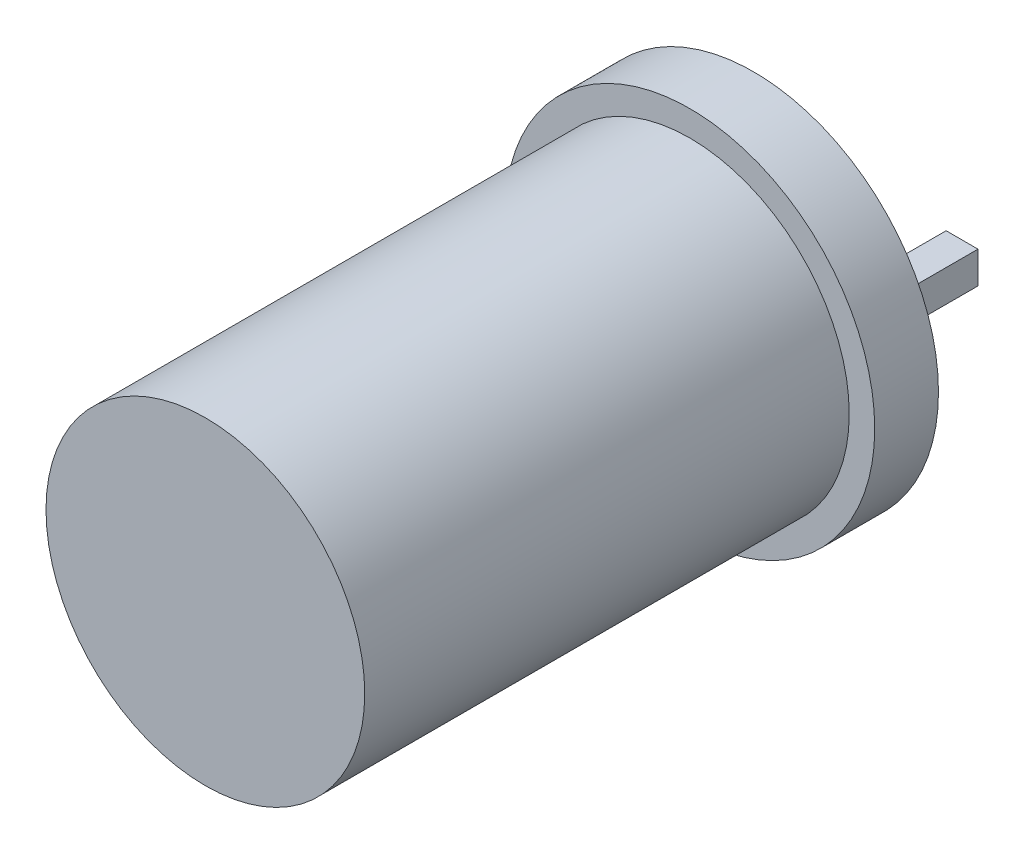
ISO-10303-21;
HEADER;
FILE_DESCRIPTION(('STEP AP214'),'2;1');
FILE_NAME('part.step','',(''),(''),'','','');
FILE_SCHEMA(('AUTOMOTIVE_DESIGN { 1 0 10303 214 1 1 1 1 }'));
ENDSEC;
DATA;
#1=APPLICATION_CONTEXT('core data for automotive mechanical design processes');
#2=APPLICATION_PROTOCOL_DEFINITION('international standard','automotive_design',2000,#1);
#3=PRODUCT_CONTEXT('',#1,'mechanical');
#4=PRODUCT('Part','Part','',(#3));
#5=PRODUCT_RELATED_PRODUCT_CATEGORY('part','',(#4));
#6=PRODUCT_DEFINITION_FORMATION('','',#4);
#7=PRODUCT_DEFINITION_CONTEXT('part definition',#1,'design');
#8=PRODUCT_DEFINITION('design','',#6,#7);
#9=PRODUCT_DEFINITION_SHAPE('','',#8);
#10=(LENGTH_UNIT() NAMED_UNIT(*) SI_UNIT(.MILLI.,.METRE.));
#11=(NAMED_UNIT(*) PLANE_ANGLE_UNIT() SI_UNIT($,.RADIAN.));
#12=(NAMED_UNIT(*) SI_UNIT($,.STERADIAN.) SOLID_ANGLE_UNIT());
#13=UNCERTAINTY_MEASURE_WITH_UNIT(LENGTH_MEASURE(1.E-05),#10,'distance_accuracy_value','');
#14=(GEOMETRIC_REPRESENTATION_CONTEXT(3) GLOBAL_UNCERTAINTY_ASSIGNED_CONTEXT((#13)) GLOBAL_UNIT_ASSIGNED_CONTEXT((#10,
#11,#12)) REPRESENTATION_CONTEXT('',''));
#15=CARTESIAN_POINT('',(0.,0.,0.));
#16=DIRECTION('',(0.,0.,1.));
#17=DIRECTION('',(1.,0.,0.));
#18=AXIS2_PLACEMENT_3D('',#15,#16,#17);
#19=CARTESIAN_POINT('',(0.,0.,0.));
#20=DIRECTION('',(0.,0.,-1.));
#21=DIRECTION('',(-1.,0.,0.));
#22=AXIS2_PLACEMENT_3D('',#19,#20,#21);
#23=CYLINDRICAL_SURFACE('',#22,2.5);
#24=CARTESIAN_POINT('',(0.,0.,-7.6));
#25=DIRECTION('',(0.,0.,1.));
#26=DIRECTION('',(1.,0.,0.));
#27=AXIS2_PLACEMENT_3D('',#24,#25,#26);
#28=CIRCLE('',#27,2.5);
#29=CARTESIAN_POINT('',(-2.5,0.,-7.6));
#30=VERTEX_POINT('',#29);
#31=EDGE_CURVE('E49',#30,#30,#28,.T.);
#32=CARTESIAN_POINT('',(0.,0.,0.));
#33=DIRECTION('',(0.,0.,1.));
#34=DIRECTION('',(1.,0.,0.));
#35=AXIS2_PLACEMENT_3D('',#32,#33,#34);
#36=CIRCLE('',#35,2.5);
#37=CARTESIAN_POINT('',(-2.5,0.,0.));
#38=VERTEX_POINT('',#37);
#39=EDGE_CURVE('E11',#38,#38,#36,.T.);
#40=CARTESIAN_POINT('',(-2.5,0.,-7.6));
#41=CARTESIAN_POINT('',(-2.5,0.,-7.52083333333333));
#42=CARTESIAN_POINT('',(-2.5,0.,-7.44166666666667));
#43=CARTESIAN_POINT('',(-2.5,0.,-7.28333333333333));
#44=CARTESIAN_POINT('',(-2.5,0.,-7.20416666666667));
#45=CARTESIAN_POINT('',(-2.5,0.,-7.04583333333333));
#46=CARTESIAN_POINT('',(-2.5,0.,-6.96666666666667));
#47=CARTESIAN_POINT('',(-2.5,0.,-6.80833333333333));
#48=CARTESIAN_POINT('',(-2.5,0.,-6.72916666666667));
#49=CARTESIAN_POINT('',(-2.5,0.,-6.57083333333333));
#50=CARTESIAN_POINT('',(-2.5,0.,-6.49166666666667));
#51=CARTESIAN_POINT('',(-2.5,0.,-6.33333333333333));
#52=CARTESIAN_POINT('',(-2.5,0.,-6.25416666666667));
#53=CARTESIAN_POINT('',(-2.5,0.,-6.09583333333333));
#54=CARTESIAN_POINT('',(-2.5,0.,-6.01666666666667));
#55=CARTESIAN_POINT('',(-2.5,0.,-5.85833333333333));
#56=CARTESIAN_POINT('',(-2.5,0.,-5.77916666666667));
#57=CARTESIAN_POINT('',(-2.5,0.,-5.62083333333333));
#58=CARTESIAN_POINT('',(-2.5,0.,-5.54166666666667));
#59=CARTESIAN_POINT('',(-2.5,0.,-5.38333333333333));
#60=CARTESIAN_POINT('',(-2.5,0.,-5.30416666666667));
#61=CARTESIAN_POINT('',(-2.5,0.,-5.14583333333333));
#62=CARTESIAN_POINT('',(-2.5,0.,-5.06666666666667));
#63=CARTESIAN_POINT('',(-2.5,0.,-4.90833333333333));
#64=CARTESIAN_POINT('',(-2.5,0.,-4.82916666666667));
#65=CARTESIAN_POINT('',(-2.5,0.,-4.67083333333333));
#66=CARTESIAN_POINT('',(-2.5,0.,-4.59166666666667));
#67=CARTESIAN_POINT('',(-2.5,0.,-4.43333333333333));
#68=CARTESIAN_POINT('',(-2.5,0.,-4.35416666666667));
#69=CARTESIAN_POINT('',(-2.5,0.,-4.19583333333333));
#70=CARTESIAN_POINT('',(-2.5,0.,-4.11666666666667));
#71=CARTESIAN_POINT('',(-2.5,0.,-3.95833333333333));
#72=CARTESIAN_POINT('',(-2.5,0.,-3.87916666666667));
#73=CARTESIAN_POINT('',(-2.5,0.,-3.72083333333333));
#74=CARTESIAN_POINT('',(-2.5,0.,-3.64166666666667));
#75=CARTESIAN_POINT('',(-2.5,0.,-3.48333333333333));
#76=CARTESIAN_POINT('',(-2.5,0.,-3.40416666666667));
#77=CARTESIAN_POINT('',(-2.5,0.,-3.24583333333333));
#78=CARTESIAN_POINT('',(-2.5,0.,-3.16666666666667));
#79=CARTESIAN_POINT('',(-2.5,0.,-3.00833333333333));
#80=CARTESIAN_POINT('',(-2.5,0.,-2.92916666666667));
#81=CARTESIAN_POINT('',(-2.5,0.,-2.77083333333333));
#82=CARTESIAN_POINT('',(-2.5,0.,-2.69166666666667));
#83=CARTESIAN_POINT('',(-2.5,0.,-2.53333333333333));
#84=CARTESIAN_POINT('',(-2.5,0.,-2.45416666666667));
#85=CARTESIAN_POINT('',(-2.5,0.,-2.29583333333333));
#86=CARTESIAN_POINT('',(-2.5,0.,-2.21666666666667));
#87=CARTESIAN_POINT('',(-2.5,0.,-2.05833333333333));
#88=CARTESIAN_POINT('',(-2.5,0.,-1.97916666666667));
#89=CARTESIAN_POINT('',(-2.5,0.,-1.82083333333333));
#90=CARTESIAN_POINT('',(-2.5,0.,-1.74166666666667));
#91=CARTESIAN_POINT('',(-2.5,0.,-1.58333333333333));
#92=CARTESIAN_POINT('',(-2.5,0.,-1.50416666666667));
#93=CARTESIAN_POINT('',(-2.5,0.,-1.34583333333333));
#94=CARTESIAN_POINT('',(-2.5,0.,-1.26666666666667));
#95=CARTESIAN_POINT('',(-2.5,0.,-1.10833333333333));
#96=CARTESIAN_POINT('',(-2.5,0.,-1.02916666666667));
#97=CARTESIAN_POINT('',(-2.5,0.,-0.870833333333334));
#98=CARTESIAN_POINT('',(-2.5,0.,-0.791666666666667));
#99=CARTESIAN_POINT('',(-2.5,0.,-0.633333333333333));
#100=CARTESIAN_POINT('',(-2.5,0.,-0.554166666666667));
#101=CARTESIAN_POINT('',(-2.5,0.,-0.395833333333333));
#102=CARTESIAN_POINT('',(-2.5,0.,-0.316666666666666));
#103=CARTESIAN_POINT('',(-2.5,0.,-0.158333333333333));
#104=CARTESIAN_POINT('',(-2.5,0.,-0.0791666666666665));
#105=CARTESIAN_POINT('',(-2.5,0.,0.));
#106=B_SPLINE_CURVE_WITH_KNOTS('',3,(#40,#41,#42,#43,#44,#45,#46,#47,#48,#49,#50,#51,#52,#53,
#54,#55,#56,#57,#58,#59,#60,#61,#62,#63,#64,#65,#66,#67,#68,#69,#70,#71,#72,#73,#74,#75,#76,#77,
#78,#79,#80,#81,#82,#83,#84,#85,#86,#87,#88,#89,#90,#91,#92,#93,#94,#95,#96,#97,#98,#99,#100,
#101,#102,#103,#104,#105),.UNSPECIFIED.,.F.,.F.,(4,2,2,2,2,2,2,2,2,2,2,2,2,2,2,2,2,2,2,2,2,2,2,
2,2,2,2,2,2,2,2,2,4),(0.,0.2375,0.475,0.7125,0.95,1.1875,1.425,1.6625,1.9,2.1375,2.375,2.6125,
2.85,3.0875,3.325,3.5625,3.8,4.0375,4.275,4.5125,4.75,4.9875,5.225,5.4625,5.7,5.9375,6.175,
6.4125,6.65,6.8875,7.125,7.3625,7.6),.UNSPECIFIED.);
#107=EDGE_CURVE('BSEAM50',#30,#38,#106,.T.);
#108=ORIENTED_EDGE('',*,*,#31,.T.);
#109=ORIENTED_EDGE('',*,*,#39,.F.);
#110=ORIENTED_EDGE('',*,*,#107,.T.);
#111=ORIENTED_EDGE('',*,*,#107,.F.);
#112=EDGE_LOOP('',(#108,#110,#109,#111));
#113=FACE_BOUND('',#112,.T.);
#114=ADVANCED_FACE('F50',(#113),#23,.T.);
#115=CARTESIAN_POINT('',(0.,0.,0.));
#116=DIRECTION('',(0.,0.,1.));
#117=DIRECTION('',(1.,0.,0.));
#118=AXIS2_PLACEMENT_3D('',#115,#116,#117);
#119=PLANE('',#118);
#120=ORIENTED_EDGE('',*,*,#39,.T.);
#121=EDGE_LOOP('',(#120));
#122=FACE_BOUND('',#121,.T.);
#123=ADVANCED_FACE('F202',(#122),#119,.T.);
#124=CARTESIAN_POINT('',(0.,0.,-7.6));
#125=DIRECTION('',(0.,0.,-1.));
#126=DIRECTION('',(-1.,0.,0.));
#127=AXIS2_PLACEMENT_3D('',#124,#125,#126);
#128=CYLINDRICAL_SURFACE('',#127,2.9);
#129=CARTESIAN_POINT('',(0.,0.,-7.6));
#130=DIRECTION('',(0.,0.,1.));
#131=DIRECTION('',(1.,0.,0.));
#132=AXIS2_PLACEMENT_3D('',#129,#130,#131);
#133=CIRCLE('',#132,2.9);
#134=CARTESIAN_POINT('',(2.9,0.,-7.6));
#135=VERTEX_POINT('',#134);
#136=EDGE_CURVE('E178',#135,#135,#133,.T.);
#137=ORIENTED_EDGE('',*,*,#136,.F.);
#138=EDGE_LOOP('',(#137));
#139=FACE_BOUND('',#138,.T.);
#140=CARTESIAN_POINT('',(0.,0.,-8.6));
#141=DIRECTION('',(0.,0.,1.));
#142=DIRECTION('',(1.,0.,0.));
#143=AXIS2_PLACEMENT_3D('',#140,#141,#142);
#144=CIRCLE('',#143,2.9);
#145=CARTESIAN_POINT('',(2.9,0.,-8.6));
#146=VERTEX_POINT('',#145);
#147=EDGE_CURVE('E148',#146,#146,#144,.T.);
#148=ORIENTED_EDGE('',*,*,#147,.T.);
#149=EDGE_LOOP('',(#148));
#150=FACE_BOUND('',#149,.T.);
#151=ADVANCED_FACE('F186',(#139,#150),#128,.T.);
#152=CARTESIAN_POINT('',(0.,0.,-7.6));
#153=DIRECTION('',(0.,0.,1.));
#154=DIRECTION('',(1.,0.,0.));
#155=AXIS2_PLACEMENT_3D('',#152,#153,#154);
#156=PLANE('',#155);
#157=ORIENTED_EDGE('',*,*,#31,.F.);
#158=EDGE_LOOP('',(#157));
#159=FACE_BOUND('',#158,.T.);
#160=ORIENTED_EDGE('',*,*,#136,.T.);
#161=EDGE_LOOP('',(#160));
#162=FACE_BOUND('',#161,.T.);
#163=ADVANCED_FACE('F192',(#159,#162),#156,.T.);
#164=CARTESIAN_POINT('',(0.,0.,-8.6));
#165=DIRECTION('',(0.,0.,1.));
#166=DIRECTION('',(1.,0.,0.));
#167=AXIS2_PLACEMENT_3D('',#164,#165,#166);
#168=PLANE('',#167);
#169=DIRECTION('',(-1.,0.,0.));
#170=VECTOR('',#169,1.);
#171=CARTESIAN_POINT('',(-1.02,0.25,-8.6));
#172=LINE('',#171,#170);
#173=CARTESIAN_POINT('',(-1.02,0.25,-8.6));
#174=VERTEX_POINT('',#173);
#175=CARTESIAN_POINT('',(-1.52,0.25,-8.6));
#176=VERTEX_POINT('',#175);
#177=EDGE_CURVE('E132',#174,#176,#172,.T.);
#178=ORIENTED_EDGE('',*,*,#177,.T.);
#179=DIRECTION('',(0.,-1.,0.));
#180=VECTOR('',#179,1.);
#181=CARTESIAN_POINT('',(-1.52,0.25,-8.6));
#182=LINE('',#181,#180);
#183=CARTESIAN_POINT('',(-1.52,-0.25,-8.6));
#184=VERTEX_POINT('',#183);
#185=EDGE_CURVE('E61',#176,#184,#182,.T.);
#186=ORIENTED_EDGE('',*,*,#185,.T.);
#187=DIRECTION('',(1.,0.,0.));
#188=VECTOR('',#187,1.);
#189=CARTESIAN_POINT('',(-1.52,-0.25,-8.6));
#190=LINE('',#189,#188);
#191=CARTESIAN_POINT('',(-1.02,-0.25,-8.6));
#192=VERTEX_POINT('',#191);
#193=EDGE_CURVE('E116',#184,#192,#190,.T.);
#194=ORIENTED_EDGE('',*,*,#193,.T.);
#195=DIRECTION('',(0.,1.,0.));
#196=VECTOR('',#195,1.);
#197=CARTESIAN_POINT('',(-1.02,-0.25,-8.6));
#198=LINE('',#197,#196);
#199=EDGE_CURVE('E137',#192,#174,#198,.T.);
#200=ORIENTED_EDGE('',*,*,#199,.T.);
#201=EDGE_LOOP('',(#178,#186,#194,#200));
#202=FACE_BOUND('',#201,.T.);
#203=DIRECTION('',(-1.,0.,0.));
#204=VECTOR('',#203,1.);
#205=CARTESIAN_POINT('',(1.52,0.25,-8.6));
#206=LINE('',#205,#204);
#207=CARTESIAN_POINT('',(1.52,0.25,-8.6));
#208=VERTEX_POINT('',#207);
#209=CARTESIAN_POINT('',(1.02,0.25,-8.6));
#210=VERTEX_POINT('',#209);
#211=EDGE_CURVE('E157',#208,#210,#206,.T.);
#212=ORIENTED_EDGE('',*,*,#211,.T.);
#213=DIRECTION('',(0.,-1.,0.));
#214=VECTOR('',#213,1.);
#215=CARTESIAN_POINT('',(1.02,0.25,-8.6));
#216=LINE('',#215,#214);
#217=CARTESIAN_POINT('',(1.02,-0.25,-8.6));
#218=VERTEX_POINT('',#217);
#219=EDGE_CURVE('E66',#210,#218,#216,.T.);
#220=ORIENTED_EDGE('',*,*,#219,.T.);
#221=DIRECTION('',(1.,0.,0.));
#222=VECTOR('',#221,1.);
#223=CARTESIAN_POINT('',(1.02,-0.25,-8.6));
#224=LINE('',#223,#222);
#225=CARTESIAN_POINT('',(1.52,-0.25,-8.6));
#226=VERTEX_POINT('',#225);
#227=EDGE_CURVE('E167',#218,#226,#224,.T.);
#228=ORIENTED_EDGE('',*,*,#227,.T.);
#229=DIRECTION('',(0.,1.,0.));
#230=VECTOR('',#229,1.);
#231=CARTESIAN_POINT('',(1.52,-0.25,-8.6));
#232=LINE('',#231,#230);
#233=EDGE_CURVE('E165',#226,#208,#232,.T.);
#234=ORIENTED_EDGE('',*,*,#233,.T.);
#235=EDGE_LOOP('',(#212,#220,#228,#234));
#236=FACE_BOUND('',#235,.T.);
#237=ORIENTED_EDGE('',*,*,#147,.F.);
#238=EDGE_LOOP('',(#237));
#239=FACE_BOUND('',#238,.T.);
#240=ADVANCED_FACE('F187',(#202,#236,#239),#168,.F.);
#241=CARTESIAN_POINT('',(1.02,0.25,-10.6));
#242=DIRECTION('',(-1.,0.,0.));
#243=DIRECTION('',(0.,0.,1.));
#244=AXIS2_PLACEMENT_3D('',#241,#242,#243);
#245=PLANE('',#244);
#246=ORIENTED_EDGE('',*,*,#219,.F.);
#247=DIRECTION('',(0.,0.,1.));
#248=VECTOR('',#247,1.);
#249=CARTESIAN_POINT('',(1.02,0.25,-10.6));
#250=LINE('',#249,#248);
#251=CARTESIAN_POINT('',(1.02,0.25,-10.6));
#252=VERTEX_POINT('',#251);
#253=EDGE_CURVE('E160',#252,#210,#250,.T.);
#254=ORIENTED_EDGE('',*,*,#253,.F.);
#255=DIRECTION('',(0.,-1.,0.));
#256=VECTOR('',#255,1.);
#257=CARTESIAN_POINT('',(1.02,0.25,-10.6));
#258=LINE('',#257,#256);
#259=CARTESIAN_POINT('',(1.02,-0.25,-10.6));
#260=VERTEX_POINT('',#259);
#261=EDGE_CURVE('E162',#252,#260,#258,.T.);
#262=ORIENTED_EDGE('',*,*,#261,.T.);
#263=DIRECTION('',(0.,0.,1.));
#264=VECTOR('',#263,1.);
#265=CARTESIAN_POINT('',(1.02,-0.25,-10.6));
#266=LINE('',#265,#264);
#267=EDGE_CURVE('E147',#260,#218,#266,.T.);
#268=ORIENTED_EDGE('',*,*,#267,.T.);
#269=EDGE_LOOP('',(#246,#254,#262,#268));
#270=FACE_BOUND('',#269,.T.);
#271=ADVANCED_FACE('F189',(#270),#245,.T.);
#272=CARTESIAN_POINT('',(1.52,0.25,-10.6));
#273=DIRECTION('',(0.,1.,0.));
#274=DIRECTION('',(0.,0.,1.));
#275=AXIS2_PLACEMENT_3D('',#272,#273,#274);
#276=PLANE('',#275);
#277=ORIENTED_EDGE('',*,*,#211,.F.);
#278=DIRECTION('',(0.,0.,1.));
#279=VECTOR('',#278,1.);
#280=CARTESIAN_POINT('',(1.52,0.25,-10.6));
#281=LINE('',#280,#279);
#282=CARTESIAN_POINT('',(1.52,0.25,-10.6));
#283=VERTEX_POINT('',#282);
#284=EDGE_CURVE('E154',#283,#208,#281,.T.);
#285=ORIENTED_EDGE('',*,*,#284,.F.);
#286=DIRECTION('',(-1.,0.,0.));
#287=VECTOR('',#286,1.);
#288=CARTESIAN_POINT('',(1.52,0.25,-10.6));
#289=LINE('',#288,#287);
#290=EDGE_CURVE('E155',#283,#252,#289,.T.);
#291=ORIENTED_EDGE('',*,*,#290,.T.);
#292=ORIENTED_EDGE('',*,*,#253,.T.);
#293=EDGE_LOOP('',(#277,#285,#291,#292));
#294=FACE_BOUND('',#293,.T.);
#295=ADVANCED_FACE('F196',(#294),#276,.T.);
#296=CARTESIAN_POINT('',(1.52,-0.25,-10.6));
#297=DIRECTION('',(1.,0.,0.));
#298=DIRECTION('',(0.,0.,-1.));
#299=AXIS2_PLACEMENT_3D('',#296,#297,#298);
#300=PLANE('',#299);
#301=ORIENTED_EDGE('',*,*,#233,.F.);
#302=DIRECTION('',(0.,0.,1.));
#303=VECTOR('',#302,1.);
#304=CARTESIAN_POINT('',(1.52,-0.25,-10.6));
#305=LINE('',#304,#303);
#306=CARTESIAN_POINT('',(1.52,-0.25,-10.6));
#307=VERTEX_POINT('',#306);
#308=EDGE_CURVE('E153',#307,#226,#305,.T.);
#309=ORIENTED_EDGE('',*,*,#308,.F.);
#310=DIRECTION('',(0.,1.,0.));
#311=VECTOR('',#310,1.);
#312=CARTESIAN_POINT('',(1.52,-0.25,-10.6));
#313=LINE('',#312,#311);
#314=EDGE_CURVE('E175',#307,#283,#313,.T.);
#315=ORIENTED_EDGE('',*,*,#314,.T.);
#316=ORIENTED_EDGE('',*,*,#284,.T.);
#317=EDGE_LOOP('',(#301,#309,#315,#316));
#318=FACE_BOUND('',#317,.T.);
#319=ADVANCED_FACE('F229',(#318),#300,.T.);
#320=CARTESIAN_POINT('',(1.02,-0.25,-10.6));
#321=DIRECTION('',(0.,-1.,0.));
#322=DIRECTION('',(0.,0.,-1.));
#323=AXIS2_PLACEMENT_3D('',#320,#321,#322);
#324=PLANE('',#323);
#325=ORIENTED_EDGE('',*,*,#227,.F.);
#326=ORIENTED_EDGE('',*,*,#267,.F.);
#327=DIRECTION('',(1.,0.,0.));
#328=VECTOR('',#327,1.);
#329=CARTESIAN_POINT('',(1.02,-0.25,-10.6));
#330=LINE('',#329,#328);
#331=EDGE_CURVE('E174',#260,#307,#330,.T.);
#332=ORIENTED_EDGE('',*,*,#331,.T.);
#333=ORIENTED_EDGE('',*,*,#308,.T.);
#334=EDGE_LOOP('',(#325,#326,#332,#333));
#335=FACE_BOUND('',#334,.T.);
#336=ADVANCED_FACE('F226',(#335),#324,.T.);
#337=CARTESIAN_POINT('',(0.,0.,-10.6));
#338=DIRECTION('',(0.,0.,1.));
#339=DIRECTION('',(1.,0.,0.));
#340=AXIS2_PLACEMENT_3D('',#337,#338,#339);
#341=PLANE('',#340);
#342=ORIENTED_EDGE('',*,*,#261,.F.);
#343=ORIENTED_EDGE('',*,*,#290,.F.);
#344=ORIENTED_EDGE('',*,*,#314,.F.);
#345=ORIENTED_EDGE('',*,*,#331,.F.);
#346=EDGE_LOOP('',(#342,#343,#344,#345));
#347=FACE_BOUND('',#346,.T.);
#348=ADVANCED_FACE('F224',(#347),#341,.F.);
#349=CARTESIAN_POINT('',(-1.52,0.25,-10.6));
#350=DIRECTION('',(-1.,0.,0.));
#351=DIRECTION('',(0.,0.,1.));
#352=AXIS2_PLACEMENT_3D('',#349,#350,#351);
#353=PLANE('',#352);
#354=ORIENTED_EDGE('',*,*,#185,.F.);
#355=DIRECTION('',(0.,0.,1.));
#356=VECTOR('',#355,1.);
#357=CARTESIAN_POINT('',(-1.52,0.25,-10.6));
#358=LINE('',#357,#356);
#359=CARTESIAN_POINT('',(-1.52,0.25,-10.6));
#360=VERTEX_POINT('',#359);
#361=EDGE_CURVE('E135',#360,#176,#358,.T.);
#362=ORIENTED_EDGE('',*,*,#361,.F.);
#363=DIRECTION('',(0.,-1.,0.));
#364=VECTOR('',#363,1.);
#365=CARTESIAN_POINT('',(-1.52,0.25,-10.6));
#366=LINE('',#365,#364);
#367=CARTESIAN_POINT('',(-1.52,-0.25,-10.6));
#368=VERTEX_POINT('',#367);
#369=EDGE_CURVE('E127',#360,#368,#366,.T.);
#370=ORIENTED_EDGE('',*,*,#369,.T.);
#371=DIRECTION('',(0.,0.,1.));
#372=VECTOR('',#371,1.);
#373=CARTESIAN_POINT('',(-1.52,-0.25,-10.6));
#374=LINE('',#373,#372);
#375=EDGE_CURVE('E112',#368,#184,#374,.T.);
#376=ORIENTED_EDGE('',*,*,#375,.T.);
#377=EDGE_LOOP('',(#354,#362,#370,#376));
#378=FACE_BOUND('',#377,.T.);
#379=ADVANCED_FACE('F131',(#378),#353,.T.);
#380=CARTESIAN_POINT('',(-1.02,0.25,-10.6));
#381=DIRECTION('',(0.,1.,0.));
#382=DIRECTION('',(0.,0.,1.));
#383=AXIS2_PLACEMENT_3D('',#380,#381,#382);
#384=PLANE('',#383);
#385=ORIENTED_EDGE('',*,*,#177,.F.);
#386=DIRECTION('',(0.,0.,1.));
#387=VECTOR('',#386,1.);
#388=CARTESIAN_POINT('',(-1.02,0.25,-10.6));
#389=LINE('',#388,#387);
#390=CARTESIAN_POINT('',(-1.02,0.25,-10.6));
#391=VERTEX_POINT('',#390);
#392=EDGE_CURVE('E150',#391,#174,#389,.T.);
#393=ORIENTED_EDGE('',*,*,#392,.F.);
#394=DIRECTION('',(-1.,0.,0.));
#395=VECTOR('',#394,1.);
#396=CARTESIAN_POINT('',(-1.02,0.25,-10.6));
#397=LINE('',#396,#395);
#398=EDGE_CURVE('E118',#391,#360,#397,.T.);
#399=ORIENTED_EDGE('',*,*,#398,.T.);
#400=ORIENTED_EDGE('',*,*,#361,.T.);
#401=EDGE_LOOP('',(#385,#393,#399,#400));
#402=FACE_BOUND('',#401,.T.);
#403=ADVANCED_FACE('F238',(#402),#384,.T.);
#404=CARTESIAN_POINT('',(-1.02,-0.25,-10.6));
#405=DIRECTION('',(1.,0.,0.));
#406=DIRECTION('',(0.,0.,-1.));
#407=AXIS2_PLACEMENT_3D('',#404,#405,#406);
#408=PLANE('',#407);
#409=ORIENTED_EDGE('',*,*,#199,.F.);
#410=DIRECTION('',(0.,0.,1.));
#411=VECTOR('',#410,1.);
#412=CARTESIAN_POINT('',(-1.02,-0.25,-10.6));
#413=LINE('',#412,#411);
#414=CARTESIAN_POINT('',(-1.02,-0.25,-10.6));
#415=VERTEX_POINT('',#414);
#416=EDGE_CURVE('E117',#415,#192,#413,.T.);
#417=ORIENTED_EDGE('',*,*,#416,.F.);
#418=DIRECTION('',(0.,1.,0.));
#419=VECTOR('',#418,1.);
#420=CARTESIAN_POINT('',(-1.02,-0.25,-10.6));
#421=LINE('',#420,#419);
#422=EDGE_CURVE('E129',#415,#391,#421,.T.);
#423=ORIENTED_EDGE('',*,*,#422,.T.);
#424=ORIENTED_EDGE('',*,*,#392,.T.);
#425=EDGE_LOOP('',(#409,#417,#423,#424));
#426=FACE_BOUND('',#425,.T.);
#427=ADVANCED_FACE('F242',(#426),#408,.T.);
#428=CARTESIAN_POINT('',(-1.52,-0.25,-10.6));
#429=DIRECTION('',(0.,-1.,0.));
#430=DIRECTION('',(0.,0.,-1.));
#431=AXIS2_PLACEMENT_3D('',#428,#429,#430);
#432=PLANE('',#431);
#433=ORIENTED_EDGE('',*,*,#193,.F.);
#434=ORIENTED_EDGE('',*,*,#375,.F.);
#435=DIRECTION('',(1.,0.,0.));
#436=VECTOR('',#435,1.);
#437=CARTESIAN_POINT('',(-1.52,-0.25,-10.6));
#438=LINE('',#437,#436);
#439=EDGE_CURVE('E111',#368,#415,#438,.T.);
#440=ORIENTED_EDGE('',*,*,#439,.T.);
#441=ORIENTED_EDGE('',*,*,#416,.T.);
#442=EDGE_LOOP('',(#433,#434,#440,#441));
#443=FACE_BOUND('',#442,.T.);
#444=ADVANCED_FACE('F114',(#443),#432,.T.);
#445=CARTESIAN_POINT('',(0.,0.,-10.6));
#446=DIRECTION('',(0.,0.,1.));
#447=DIRECTION('',(1.,0.,0.));
#448=AXIS2_PLACEMENT_3D('',#445,#446,#447);
#449=PLANE('',#448);
#450=ORIENTED_EDGE('',*,*,#369,.F.);
#451=ORIENTED_EDGE('',*,*,#398,.F.);
#452=ORIENTED_EDGE('',*,*,#422,.F.);
#453=ORIENTED_EDGE('',*,*,#439,.F.);
#454=EDGE_LOOP('',(#450,#451,#452,#453));
#455=FACE_BOUND('',#454,.T.);
#456=ADVANCED_FACE('F121',(#455),#449,.F.);
#457=CLOSED_SHELL('',(#114,#123,#151,#163,#240,#271,#295,#319,#336,#348,#379,#403,#427,#444,#456));
#458=MANIFOLD_SOLID_BREP('B2',#457);
#459=ADVANCED_BREP_SHAPE_REPRESENTATION('',(#18,#458),#14);
#460=SHAPE_DEFINITION_REPRESENTATION(#9,#459);
ENDSEC;
END-ISO-10303-21;
